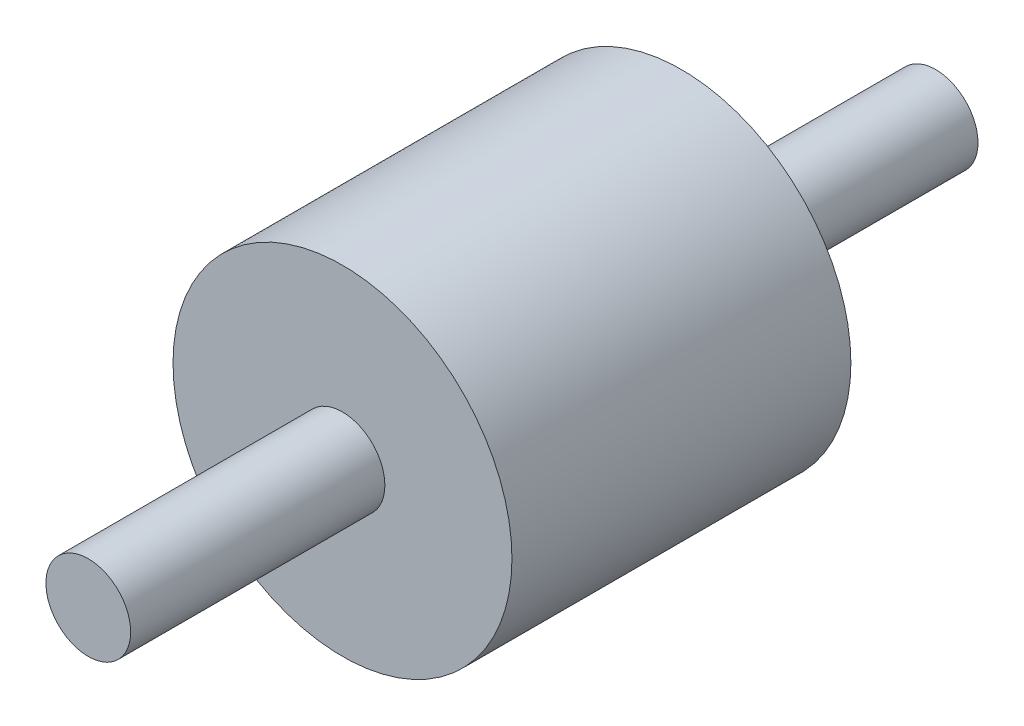
ISO-10303-21;
HEADER;
FILE_DESCRIPTION(('STEP AP214'),'2;1');
FILE_NAME('part.step','',(''),(''),'','','');
FILE_SCHEMA(('AUTOMOTIVE_DESIGN { 1 0 10303 214 1 1 1 1 }'));
ENDSEC;
DATA;
#1=APPLICATION_CONTEXT('core data for automotive mechanical design processes');
#2=APPLICATION_PROTOCOL_DEFINITION('international standard','automotive_design',2000,#1);
#3=PRODUCT_CONTEXT('',#1,'mechanical');
#4=PRODUCT('Part','Part','',(#3));
#5=PRODUCT_RELATED_PRODUCT_CATEGORY('part','',(#4));
#6=PRODUCT_DEFINITION_FORMATION('','',#4);
#7=PRODUCT_DEFINITION_CONTEXT('part definition',#1,'design');
#8=PRODUCT_DEFINITION('design','',#6,#7);
#9=PRODUCT_DEFINITION_SHAPE('','',#8);
#10=(LENGTH_UNIT() NAMED_UNIT(*) SI_UNIT(.MILLI.,.METRE.));
#11=(NAMED_UNIT(*) PLANE_ANGLE_UNIT() SI_UNIT($,.RADIAN.));
#12=(NAMED_UNIT(*) SI_UNIT($,.STERADIAN.) SOLID_ANGLE_UNIT());
#13=UNCERTAINTY_MEASURE_WITH_UNIT(LENGTH_MEASURE(1.E-05),#10,'distance_accuracy_value','');
#14=(GEOMETRIC_REPRESENTATION_CONTEXT(3) GLOBAL_UNCERTAINTY_ASSIGNED_CONTEXT((#13)) GLOBAL_UNIT_ASSIGNED_CONTEXT((#10,
#11,#12)) REPRESENTATION_CONTEXT('',''));
#15=CARTESIAN_POINT('',(0.,0.,0.));
#16=DIRECTION('',(0.,0.,1.));
#17=DIRECTION('',(1.,0.,0.));
#18=AXIS2_PLACEMENT_3D('',#15,#16,#17);
#19=CARTESIAN_POINT('',(0.,0.,-4.));
#20=DIRECTION('',(0.,0.,1.));
#21=DIRECTION('',(1.,0.,0.));
#22=AXIS2_PLACEMENT_3D('',#19,#20,#21);
#23=CYLINDRICAL_SURFACE('',#22,4.);
#24=CARTESIAN_POINT('',(0.,0.,-4.));
#25=DIRECTION('',(0.,0.,1.));
#26=DIRECTION('',(1.,0.,0.));
#27=AXIS2_PLACEMENT_3D('',#24,#25,#26);
#28=CIRCLE('',#27,4.);
#29=CARTESIAN_POINT('',(4.,0.,-4.));
#30=VERTEX_POINT('',#29);
#31=EDGE_CURVE('E36',#30,#30,#28,.T.);
#32=ORIENTED_EDGE('',*,*,#31,.T.);
#33=EDGE_LOOP('',(#32));
#34=FACE_BOUND('',#33,.T.);
#35=CARTESIAN_POINT('',(0.,0.,4.));
#36=DIRECTION('',(0.,0.,1.));
#37=DIRECTION('',(1.,0.,0.));
#38=AXIS2_PLACEMENT_3D('',#35,#36,#37);
#39=CIRCLE('',#38,4.);
#40=CARTESIAN_POINT('',(4.,0.,4.));
#41=VERTEX_POINT('',#40);
#42=EDGE_CURVE('E40',#41,#41,#39,.T.);
#43=ORIENTED_EDGE('',*,*,#42,.F.);
#44=EDGE_LOOP('',(#43));
#45=FACE_BOUND('',#44,.T.);
#46=ADVANCED_FACE('F30',(#34,#45),#23,.T.);
#47=CARTESIAN_POINT('',(0.,0.,-4.));
#48=DIRECTION('',(0.,0.,1.));
#49=DIRECTION('',(1.,0.,0.));
#50=AXIS2_PLACEMENT_3D('',#47,#48,#49);
#51=PLANE('',#50);
#52=CARTESIAN_POINT('',(0.,0.,-4.));
#53=DIRECTION('',(0.,0.,1.));
#54=DIRECTION('',(1.,0.,0.));
#55=AXIS2_PLACEMENT_3D('',#52,#53,#54);
#56=CIRCLE('',#55,1.);
#57=CARTESIAN_POINT('',(1.,0.,-4.));
#58=VERTEX_POINT('',#57);
#59=EDGE_CURVE('E44',#58,#58,#56,.T.);
#60=ORIENTED_EDGE('',*,*,#59,.T.);
#61=EDGE_LOOP('',(#60));
#62=FACE_BOUND('',#61,.T.);
#63=ORIENTED_EDGE('',*,*,#31,.F.);
#64=EDGE_LOOP('',(#63));
#65=FACE_BOUND('',#64,.T.);
#66=ADVANCED_FACE('F73',(#62,#65),#51,.F.);
#67=CARTESIAN_POINT('',(0.,0.,4.));
#68=DIRECTION('',(0.,0.,1.));
#69=DIRECTION('',(1.,0.,0.));
#70=AXIS2_PLACEMENT_3D('',#67,#68,#69);
#71=PLANE('',#70);
#72=CARTESIAN_POINT('',(0.,0.,4.));
#73=DIRECTION('',(0.,0.,1.));
#74=DIRECTION('',(1.,0.,0.));
#75=AXIS2_PLACEMENT_3D('',#72,#73,#74);
#76=CIRCLE('',#75,1.);
#77=CARTESIAN_POINT('',(1.,0.,4.));
#78=VERTEX_POINT('',#77);
#79=EDGE_CURVE('E10',#78,#78,#76,.T.);
#80=ORIENTED_EDGE('',*,*,#79,.F.);
#81=EDGE_LOOP('',(#80));
#82=FACE_BOUND('',#81,.T.);
#83=ORIENTED_EDGE('',*,*,#42,.T.);
#84=EDGE_LOOP('',(#83));
#85=FACE_BOUND('',#84,.T.);
#86=ADVANCED_FACE('F68',(#82,#85),#71,.T.);
#87=CARTESIAN_POINT('',(0.,0.,10.));
#88=DIRECTION('',(0.,0.,1.));
#89=DIRECTION('',(1.,0.,0.));
#90=AXIS2_PLACEMENT_3D('',#87,#88,#89);
#91=PLANE('',#90);
#92=CARTESIAN_POINT('',(0.,0.,10.));
#93=DIRECTION('',(0.,0.,1.));
#94=DIRECTION('',(1.,0.,0.));
#95=AXIS2_PLACEMENT_3D('',#92,#93,#94);
#96=CIRCLE('',#95,1.);
#97=CARTESIAN_POINT('',(1.,0.,10.));
#98=VERTEX_POINT('',#97);
#99=EDGE_CURVE('E52',#98,#98,#96,.T.);
#100=ORIENTED_EDGE('',*,*,#99,.T.);
#101=EDGE_LOOP('',(#100));
#102=FACE_BOUND('',#101,.T.);
#103=ADVANCED_FACE('F56',(#102),#91,.T.);
#104=CARTESIAN_POINT('',(0.,0.,-10.));
#105=DIRECTION('',(0.,0.,1.));
#106=DIRECTION('',(1.,0.,0.));
#107=AXIS2_PLACEMENT_3D('',#104,#105,#106);
#108=CYLINDRICAL_SURFACE('',#107,1.);
#109=ORIENTED_EDGE('',*,*,#79,.T.);
#110=EDGE_LOOP('',(#109));
#111=FACE_BOUND('',#110,.T.);
#112=ORIENTED_EDGE('',*,*,#99,.F.);
#113=EDGE_LOOP('',(#112));
#114=FACE_BOUND('',#113,.T.);
#115=ADVANCED_FACE('F58',(#111,#114),#108,.T.);
#116=CARTESIAN_POINT('',(0.,0.,-10.));
#117=DIRECTION('',(0.,0.,1.));
#118=DIRECTION('',(1.,0.,0.));
#119=AXIS2_PLACEMENT_3D('',#116,#117,#118);
#120=CIRCLE('',#119,1.);
#121=CARTESIAN_POINT('',(1.,0.,-10.));
#122=VERTEX_POINT('',#121);
#123=EDGE_CURVE('E49',#122,#122,#120,.T.);
#124=ORIENTED_EDGE('',*,*,#123,.T.);
#125=EDGE_LOOP('',(#124));
#126=FACE_BOUND('',#125,.T.);
#127=ORIENTED_EDGE('',*,*,#59,.F.);
#128=EDGE_LOOP('',(#127));
#129=FACE_BOUND('',#128,.T.);
#130=ADVANCED_FACE('F60',(#126,#129),#108,.T.);
#131=CARTESIAN_POINT('',(0.,0.,-10.));
#132=DIRECTION('',(0.,0.,1.));
#133=DIRECTION('',(1.,0.,0.));
#134=AXIS2_PLACEMENT_3D('',#131,#132,#133);
#135=PLANE('',#134);
#136=ORIENTED_EDGE('',*,*,#123,.F.);
#137=EDGE_LOOP('',(#136));
#138=FACE_BOUND('',#137,.T.);
#139=ADVANCED_FACE('F66',(#138),#135,.F.);
#140=CLOSED_SHELL('',(#46,#66,#86,#103,#115,#130,#139));
#141=MANIFOLD_SOLID_BREP('B2',#140);
#142=ADVANCED_BREP_SHAPE_REPRESENTATION('',(#18,#141),#14);
#143=SHAPE_DEFINITION_REPRESENTATION(#9,#142);
ENDSEC;
END-ISO-10303-21;
